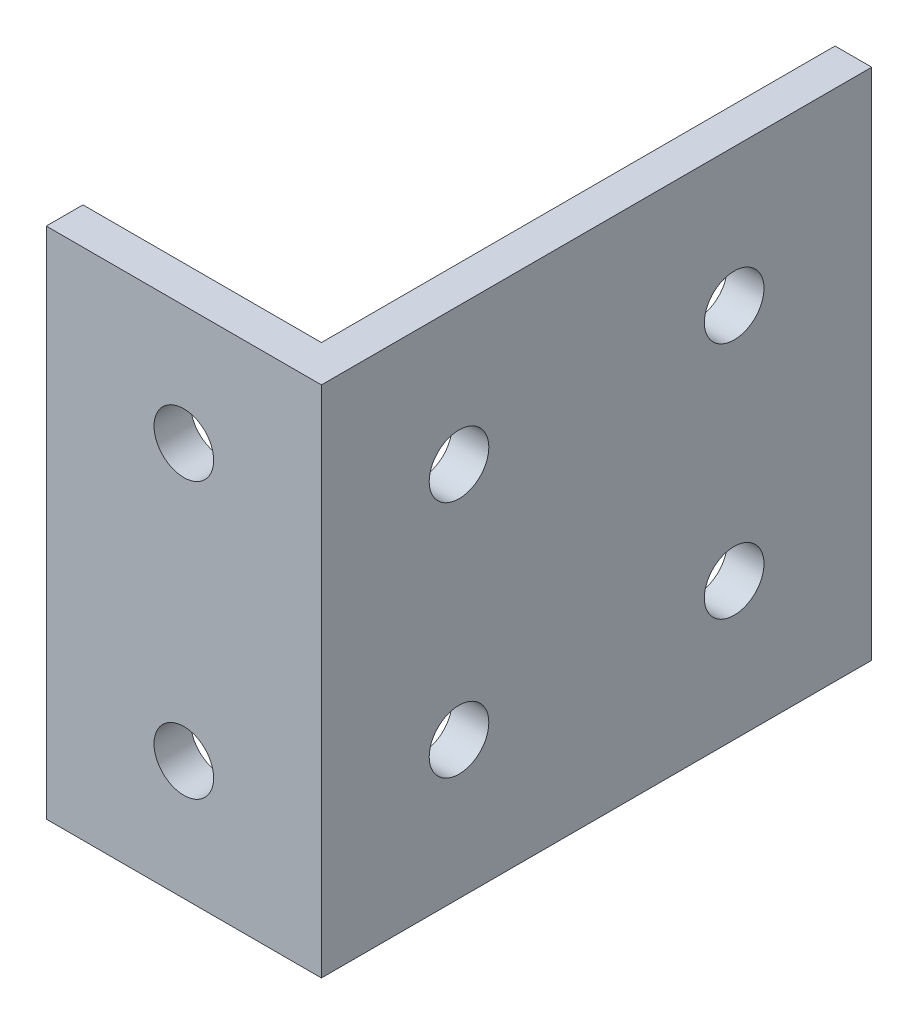
ISO-10303-21;
HEADER;
FILE_DESCRIPTION(('STEP AP214'),'2;1');
FILE_NAME('part.step','',(''),(''),'','','');
FILE_SCHEMA(('AUTOMOTIVE_DESIGN { 1 0 10303 214 1 1 1 1 }'));
ENDSEC;
DATA;
#1=APPLICATION_CONTEXT('core data for automotive mechanical design processes');
#2=APPLICATION_PROTOCOL_DEFINITION('international standard','automotive_design',2000,#1);
#3=PRODUCT_CONTEXT('',#1,'mechanical');
#4=PRODUCT('Part','Part','',(#3));
#5=PRODUCT_RELATED_PRODUCT_CATEGORY('part','',(#4));
#6=PRODUCT_DEFINITION_FORMATION('','',#4);
#7=PRODUCT_DEFINITION_CONTEXT('part definition',#1,'design');
#8=PRODUCT_DEFINITION('design','',#6,#7);
#9=PRODUCT_DEFINITION_SHAPE('','',#8);
#10=(LENGTH_UNIT() NAMED_UNIT(*) SI_UNIT(.MILLI.,.METRE.));
#11=(NAMED_UNIT(*) PLANE_ANGLE_UNIT() SI_UNIT($,.RADIAN.));
#12=(NAMED_UNIT(*) SI_UNIT($,.STERADIAN.) SOLID_ANGLE_UNIT());
#13=UNCERTAINTY_MEASURE_WITH_UNIT(LENGTH_MEASURE(1.E-05),#10,'distance_accuracy_value','');
#14=(GEOMETRIC_REPRESENTATION_CONTEXT(3) GLOBAL_UNCERTAINTY_ASSIGNED_CONTEXT((#13)) GLOBAL_UNIT_ASSIGNED_CONTEXT((#10,
#11,#12)) REPRESENTATION_CONTEXT('',''));
#15=CARTESIAN_POINT('',(0.,0.,0.));
#16=DIRECTION('',(0.,0.,1.));
#17=DIRECTION('',(1.,0.,0.));
#18=AXIS2_PLACEMENT_3D('',#15,#16,#17);
#19=CARTESIAN_POINT('',(0.,56.,-60.));
#20=DIRECTION('',(-1.,0.,0.));
#21=DIRECTION('',(0.,0.,1.));
#22=AXIS2_PLACEMENT_3D('',#19,#20,#21);
#23=PLANE('',#22);
#24=CARTESIAN_POINT('',(0.,41.,-45.));
#25=DIRECTION('',(-1.,0.,0.));
#26=DIRECTION('',(0.,0.,1.));
#27=AXIS2_PLACEMENT_3D('',#24,#25,#26);
#28=CIRCLE('',#27,3.25000000000001);
#29=CARTESIAN_POINT('',(0.,41.,-41.75));
#30=VERTEX_POINT('',#29);
#31=EDGE_CURVE('E164',#30,#30,#28,.T.);
#32=ORIENTED_EDGE('',*,*,#31,.T.);
#33=EDGE_LOOP('',(#32));
#34=FACE_BOUND('',#33,.T.);
#35=CARTESIAN_POINT('',(0.,15.,-45.));
#36=DIRECTION('',(-1.,0.,0.));
#37=DIRECTION('',(0.,0.,1.));
#38=AXIS2_PLACEMENT_3D('',#35,#36,#37);
#39=CIRCLE('',#38,3.25000000000001);
#40=CARTESIAN_POINT('',(0.,15.,-41.75));
#41=VERTEX_POINT('',#40);
#42=EDGE_CURVE('E153',#41,#41,#39,.T.);
#43=ORIENTED_EDGE('',*,*,#42,.T.);
#44=EDGE_LOOP('',(#43));
#45=FACE_BOUND('',#44,.T.);
#46=CARTESIAN_POINT('',(0.,15.,-15.));
#47=DIRECTION('',(-1.,0.,0.));
#48=DIRECTION('',(0.,0.,1.));
#49=AXIS2_PLACEMENT_3D('',#46,#47,#48);
#50=CIRCLE('',#49,3.25000000000001);
#51=CARTESIAN_POINT('',(0.,15.,-11.75));
#52=VERTEX_POINT('',#51);
#53=EDGE_CURVE('E150',#52,#52,#50,.T.);
#54=ORIENTED_EDGE('',*,*,#53,.T.);
#55=EDGE_LOOP('',(#54));
#56=FACE_BOUND('',#55,.T.);
#57=CARTESIAN_POINT('',(0.,41.,-15.));
#58=DIRECTION('',(-1.,0.,0.));
#59=DIRECTION('',(0.,0.,1.));
#60=AXIS2_PLACEMENT_3D('',#57,#58,#59);
#61=CIRCLE('',#60,3.25000000000001);
#62=CARTESIAN_POINT('',(0.,41.,-11.75));
#63=VERTEX_POINT('',#62);
#64=EDGE_CURVE('E147',#63,#63,#61,.T.);
#65=ORIENTED_EDGE('',*,*,#64,.T.);
#66=EDGE_LOOP('',(#65));
#67=FACE_BOUND('',#66,.T.);
#68=DIRECTION('',(0.,0.,-1.));
#69=VECTOR('',#68,1.);
#70=CARTESIAN_POINT('',(0.,0.,-60.));
#71=LINE('',#70,#69);
#72=CARTESIAN_POINT('',(0.,0.,0.));
#73=VERTEX_POINT('',#72);
#74=CARTESIAN_POINT('',(0.,0.,-60.));
#75=VERTEX_POINT('',#74);
#76=EDGE_CURVE('E127',#73,#75,#71,.T.);
#77=ORIENTED_EDGE('',*,*,#76,.T.);
#78=DIRECTION('',(0.,-1.,0.));
#79=VECTOR('',#78,1.);
#80=CARTESIAN_POINT('',(0.,56.,-60.));
#81=LINE('',#80,#79);
#82=CARTESIAN_POINT('',(0.,56.,-60.));
#83=VERTEX_POINT('',#82);
#84=EDGE_CURVE('E11',#83,#75,#81,.T.);
#85=ORIENTED_EDGE('',*,*,#84,.F.);
#86=DIRECTION('',(0.,0.,-1.));
#87=VECTOR('',#86,1.);
#88=CARTESIAN_POINT('',(0.,56.,-60.));
#89=LINE('',#88,#87);
#90=CARTESIAN_POINT('',(0.,56.,0.));
#91=VERTEX_POINT('',#90);
#92=EDGE_CURVE('E138',#91,#83,#89,.T.);
#93=ORIENTED_EDGE('',*,*,#92,.F.);
#94=DIRECTION('',(0.,-1.,0.));
#95=VECTOR('',#94,1.);
#96=CARTESIAN_POINT('',(0.,56.,0.));
#97=LINE('',#96,#95);
#98=EDGE_CURVE('E123',#91,#73,#97,.T.);
#99=ORIENTED_EDGE('',*,*,#98,.T.);
#100=EDGE_LOOP('',(#77,#85,#93,#99));
#101=FACE_BOUND('',#100,.T.);
#102=ADVANCED_FACE('F41',(#34,#45,#56,#67,#101),#23,.F.);
#103=CARTESIAN_POINT('',(-3.99999999999999,56.,-60.));
#104=DIRECTION('',(0.,0.,1.));
#105=DIRECTION('',(1.,0.,0.));
#106=AXIS2_PLACEMENT_3D('',#103,#104,#105);
#107=PLANE('',#106);
#108=DIRECTION('',(-1.,0.,0.));
#109=VECTOR('',#108,1.);
#110=CARTESIAN_POINT('',(-3.99999999999999,0.,-60.));
#111=LINE('',#110,#109);
#112=CARTESIAN_POINT('',(-3.99999999999999,0.,-60.));
#113=VERTEX_POINT('',#112);
#114=EDGE_CURVE('E130',#75,#113,#111,.T.);
#115=ORIENTED_EDGE('',*,*,#114,.T.);
#116=DIRECTION('',(0.,-1.,0.));
#117=VECTOR('',#116,1.);
#118=CARTESIAN_POINT('',(-3.99999999999999,56.,-60.));
#119=LINE('',#118,#117);
#120=CARTESIAN_POINT('',(-3.99999999999999,56.,-60.));
#121=VERTEX_POINT('',#120);
#122=EDGE_CURVE('E50',#121,#113,#119,.T.);
#123=ORIENTED_EDGE('',*,*,#122,.F.);
#124=DIRECTION('',(-1.,0.,0.));
#125=VECTOR('',#124,1.);
#126=CARTESIAN_POINT('',(-3.99999999999999,56.,-60.));
#127=LINE('',#126,#125);
#128=EDGE_CURVE('E96',#83,#121,#127,.T.);
#129=ORIENTED_EDGE('',*,*,#128,.F.);
#130=ORIENTED_EDGE('',*,*,#84,.T.);
#131=EDGE_LOOP('',(#115,#123,#129,#130));
#132=FACE_BOUND('',#131,.T.);
#133=ADVANCED_FACE('F181',(#132),#107,.F.);
#134=CARTESIAN_POINT('',(-3.99999999999999,56.,-4.));
#135=DIRECTION('',(1.,0.,0.));
#136=DIRECTION('',(0.,0.,-1.));
#137=AXIS2_PLACEMENT_3D('',#134,#135,#136);
#138=PLANE('',#137);
#139=CARTESIAN_POINT('',(-3.99999999999999,41.,-45.));
#140=DIRECTION('',(1.,0.,0.));
#141=DIRECTION('',(0.,0.,-1.));
#142=AXIS2_PLACEMENT_3D('',#139,#140,#141);
#143=CIRCLE('',#142,3.25000000000001);
#144=CARTESIAN_POINT('',(-3.99999999999999,41.,-48.25));
#145=VERTEX_POINT('',#144);
#146=EDGE_CURVE('E44',#145,#145,#143,.T.);
#147=ORIENTED_EDGE('',*,*,#146,.T.);
#148=EDGE_LOOP('',(#147));
#149=FACE_BOUND('',#148,.T.);
#150=CARTESIAN_POINT('',(-3.99999999999999,15.,-45.));
#151=DIRECTION('',(1.,0.,0.));
#152=DIRECTION('',(0.,0.,-1.));
#153=AXIS2_PLACEMENT_3D('',#150,#151,#152);
#154=CIRCLE('',#153,3.25000000000001);
#155=CARTESIAN_POINT('',(-3.99999999999999,15.,-48.25));
#156=VERTEX_POINT('',#155);
#157=EDGE_CURVE('E151',#156,#156,#154,.T.);
#158=ORIENTED_EDGE('',*,*,#157,.T.);
#159=EDGE_LOOP('',(#158));
#160=FACE_BOUND('',#159,.T.);
#161=CARTESIAN_POINT('',(-3.99999999999999,15.,-15.));
#162=DIRECTION('',(1.,0.,0.));
#163=DIRECTION('',(0.,0.,-1.));
#164=AXIS2_PLACEMENT_3D('',#161,#162,#163);
#165=CIRCLE('',#164,3.25000000000001);
#166=CARTESIAN_POINT('',(-3.99999999999999,15.,-18.25));
#167=VERTEX_POINT('',#166);
#168=EDGE_CURVE('E148',#167,#167,#165,.T.);
#169=ORIENTED_EDGE('',*,*,#168,.T.);
#170=EDGE_LOOP('',(#169));
#171=FACE_BOUND('',#170,.T.);
#172=CARTESIAN_POINT('',(-3.99999999999999,41.,-15.));
#173=DIRECTION('',(1.,0.,0.));
#174=DIRECTION('',(0.,0.,-1.));
#175=AXIS2_PLACEMENT_3D('',#172,#173,#174);
#176=CIRCLE('',#175,3.25000000000001);
#177=CARTESIAN_POINT('',(-3.99999999999999,41.,-18.25));
#178=VERTEX_POINT('',#177);
#179=EDGE_CURVE('E144',#178,#178,#176,.T.);
#180=ORIENTED_EDGE('',*,*,#179,.T.);
#181=EDGE_LOOP('',(#180));
#182=FACE_BOUND('',#181,.T.);
#183=DIRECTION('',(0.,0.,1.));
#184=VECTOR('',#183,1.);
#185=CARTESIAN_POINT('',(-3.99999999999999,0.,-4.));
#186=LINE('',#185,#184);
#187=CARTESIAN_POINT('',(-3.99999999999999,0.,-4.));
#188=VERTEX_POINT('',#187);
#189=EDGE_CURVE('E133',#113,#188,#186,.T.);
#190=ORIENTED_EDGE('',*,*,#189,.T.);
#191=DIRECTION('',(0.,-1.,0.));
#192=VECTOR('',#191,1.);
#193=CARTESIAN_POINT('',(-3.99999999999999,56.,-4.));
#194=LINE('',#193,#192);
#195=CARTESIAN_POINT('',(-3.99999999999999,56.,-4.));
#196=VERTEX_POINT('',#195);
#197=EDGE_CURVE('E118',#196,#188,#194,.T.);
#198=ORIENTED_EDGE('',*,*,#197,.F.);
#199=DIRECTION('',(0.,0.,1.));
#200=VECTOR('',#199,1.);
#201=CARTESIAN_POINT('',(-3.99999999999999,56.,-4.));
#202=LINE('',#201,#200);
#203=EDGE_CURVE('E109',#121,#196,#202,.T.);
#204=ORIENTED_EDGE('',*,*,#203,.F.);
#205=ORIENTED_EDGE('',*,*,#122,.T.);
#206=EDGE_LOOP('',(#190,#198,#204,#205));
#207=FACE_BOUND('',#206,.T.);
#208=ADVANCED_FACE('F184',(#149,#160,#171,#182,#207),#138,.F.);
#209=CARTESIAN_POINT('',(-30.,56.,-4.));
#210=DIRECTION('',(0.,0.,1.));
#211=DIRECTION('',(1.,0.,0.));
#212=AXIS2_PLACEMENT_3D('',#209,#210,#211);
#213=PLANE('',#212);
#214=CARTESIAN_POINT('',(-15.,43.,-4.));
#215=DIRECTION('',(0.,0.,1.));
#216=DIRECTION('',(1.,0.,0.));
#217=AXIS2_PLACEMENT_3D('',#214,#215,#216);
#218=CIRCLE('',#217,3.25000000000001);
#219=CARTESIAN_POINT('',(-11.75,43.,-4.));
#220=VERTEX_POINT('',#219);
#221=EDGE_CURVE('E131',#220,#220,#218,.T.);
#222=ORIENTED_EDGE('',*,*,#221,.T.);
#223=EDGE_LOOP('',(#222));
#224=FACE_BOUND('',#223,.T.);
#225=CARTESIAN_POINT('',(-15.,13.,-4.));
#226=DIRECTION('',(0.,0.,1.));
#227=DIRECTION('',(1.,0.,0.));
#228=AXIS2_PLACEMENT_3D('',#225,#226,#227);
#229=CIRCLE('',#228,3.25);
#230=CARTESIAN_POINT('',(-11.75,13.,-4.));
#231=VERTEX_POINT('',#230);
#232=EDGE_CURVE('E171',#231,#231,#229,.T.);
#233=ORIENTED_EDGE('',*,*,#232,.T.);
#234=EDGE_LOOP('',(#233));
#235=FACE_BOUND('',#234,.T.);
#236=DIRECTION('',(-1.,0.,0.));
#237=VECTOR('',#236,1.);
#238=CARTESIAN_POINT('',(-30.,0.,-4.));
#239=LINE('',#238,#237);
#240=CARTESIAN_POINT('',(-30.,0.,-4.));
#241=VERTEX_POINT('',#240);
#242=EDGE_CURVE('E117',#188,#241,#239,.T.);
#243=ORIENTED_EDGE('',*,*,#242,.T.);
#244=DIRECTION('',(0.,-1.,0.));
#245=VECTOR('',#244,1.);
#246=CARTESIAN_POINT('',(-30.,56.,-4.));
#247=LINE('',#246,#245);
#248=CARTESIAN_POINT('',(-30.,56.,-4.));
#249=VERTEX_POINT('',#248);
#250=EDGE_CURVE('E114',#249,#241,#247,.T.);
#251=ORIENTED_EDGE('',*,*,#250,.F.);
#252=DIRECTION('',(-1.,0.,0.));
#253=VECTOR('',#252,1.);
#254=CARTESIAN_POINT('',(-30.,56.,-4.));
#255=LINE('',#254,#253);
#256=EDGE_CURVE('E103',#196,#249,#255,.T.);
#257=ORIENTED_EDGE('',*,*,#256,.F.);
#258=ORIENTED_EDGE('',*,*,#197,.T.);
#259=EDGE_LOOP('',(#243,#251,#257,#258));
#260=FACE_BOUND('',#259,.T.);
#261=ADVANCED_FACE('F115',(#224,#235,#260),#213,.F.);
#262=CARTESIAN_POINT('',(-30.,56.,0.));
#263=DIRECTION('',(1.,0.,0.));
#264=DIRECTION('',(0.,0.,-1.));
#265=AXIS2_PLACEMENT_3D('',#262,#263,#264);
#266=PLANE('',#265);
#267=DIRECTION('',(0.,0.,1.));
#268=VECTOR('',#267,1.);
#269=CARTESIAN_POINT('',(-30.,0.,0.));
#270=LINE('',#269,#268);
#271=CARTESIAN_POINT('',(-30.,0.,0.));
#272=VERTEX_POINT('',#271);
#273=EDGE_CURVE('E82',#241,#272,#270,.T.);
#274=ORIENTED_EDGE('',*,*,#273,.T.);
#275=DIRECTION('',(0.,-1.,0.));
#276=VECTOR('',#275,1.);
#277=CARTESIAN_POINT('',(-30.,56.,0.));
#278=LINE('',#277,#276);
#279=CARTESIAN_POINT('',(-30.,56.,0.));
#280=VERTEX_POINT('',#279);
#281=EDGE_CURVE('E119',#280,#272,#278,.T.);
#282=ORIENTED_EDGE('',*,*,#281,.F.);
#283=DIRECTION('',(0.,0.,1.));
#284=VECTOR('',#283,1.);
#285=CARTESIAN_POINT('',(-30.,56.,0.));
#286=LINE('',#285,#284);
#287=EDGE_CURVE('E107',#249,#280,#286,.T.);
#288=ORIENTED_EDGE('',*,*,#287,.F.);
#289=ORIENTED_EDGE('',*,*,#250,.T.);
#290=EDGE_LOOP('',(#274,#282,#288,#289));
#291=FACE_BOUND('',#290,.T.);
#292=ADVANCED_FACE('F121',(#291),#266,.F.);
#293=CARTESIAN_POINT('',(0.,56.,0.));
#294=DIRECTION('',(0.,0.,-1.));
#295=DIRECTION('',(-1.,0.,0.));
#296=AXIS2_PLACEMENT_3D('',#293,#294,#295);
#297=PLANE('',#296);
#298=CARTESIAN_POINT('',(-15.,43.,0.));
#299=DIRECTION('',(0.,0.,-1.));
#300=DIRECTION('',(-1.,0.,0.));
#301=AXIS2_PLACEMENT_3D('',#298,#299,#300);
#302=CIRCLE('',#301,3.25000000000001);
#303=CARTESIAN_POINT('',(-18.25,43.,0.));
#304=VERTEX_POINT('',#303);
#305=EDGE_CURVE('E168',#304,#304,#302,.T.);
#306=ORIENTED_EDGE('',*,*,#305,.T.);
#307=EDGE_LOOP('',(#306));
#308=FACE_BOUND('',#307,.T.);
#309=CARTESIAN_POINT('',(-15.,13.,0.));
#310=DIRECTION('',(0.,0.,-1.));
#311=DIRECTION('',(-1.,0.,0.));
#312=AXIS2_PLACEMENT_3D('',#309,#310,#311);
#313=CIRCLE('',#312,3.25);
#314=CARTESIAN_POINT('',(-18.25,13.,0.));
#315=VERTEX_POINT('',#314);
#316=EDGE_CURVE('E167',#315,#315,#313,.T.);
#317=ORIENTED_EDGE('',*,*,#316,.T.);
#318=EDGE_LOOP('',(#317));
#319=FACE_BOUND('',#318,.T.);
#320=DIRECTION('',(1.,0.,0.));
#321=VECTOR('',#320,1.);
#322=CARTESIAN_POINT('',(0.,0.,0.));
#323=LINE('',#322,#321);
#324=EDGE_CURVE('E88',#272,#73,#323,.T.);
#325=ORIENTED_EDGE('',*,*,#324,.T.);
#326=ORIENTED_EDGE('',*,*,#98,.F.);
#327=DIRECTION('',(1.,0.,0.));
#328=VECTOR('',#327,1.);
#329=CARTESIAN_POINT('',(0.,56.,0.));
#330=LINE('',#329,#328);
#331=EDGE_CURVE('E59',#280,#91,#330,.T.);
#332=ORIENTED_EDGE('',*,*,#331,.F.);
#333=ORIENTED_EDGE('',*,*,#281,.T.);
#334=EDGE_LOOP('',(#325,#326,#332,#333));
#335=FACE_BOUND('',#334,.T.);
#336=ADVANCED_FACE('F189',(#308,#319,#335),#297,.F.);
#337=CARTESIAN_POINT('',(0.,56.,0.));
#338=DIRECTION('',(0.,-1.,0.));
#339=DIRECTION('',(0.,0.,-1.));
#340=AXIS2_PLACEMENT_3D('',#337,#338,#339);
#341=PLANE('',#340);
#342=ORIENTED_EDGE('',*,*,#92,.T.);
#343=ORIENTED_EDGE('',*,*,#128,.T.);
#344=ORIENTED_EDGE('',*,*,#203,.T.);
#345=ORIENTED_EDGE('',*,*,#256,.T.);
#346=ORIENTED_EDGE('',*,*,#287,.T.);
#347=ORIENTED_EDGE('',*,*,#331,.T.);
#348=EDGE_LOOP('',(#342,#343,#344,#345,#346,#347));
#349=FACE_BOUND('',#348,.T.);
#350=ADVANCED_FACE('F105',(#349),#341,.F.);
#351=CARTESIAN_POINT('',(0.,0.,0.));
#352=DIRECTION('',(0.,-1.,0.));
#353=DIRECTION('',(0.,0.,-1.));
#354=AXIS2_PLACEMENT_3D('',#351,#352,#353);
#355=PLANE('',#354);
#356=ORIENTED_EDGE('',*,*,#76,.F.);
#357=ORIENTED_EDGE('',*,*,#324,.F.);
#358=ORIENTED_EDGE('',*,*,#273,.F.);
#359=ORIENTED_EDGE('',*,*,#242,.F.);
#360=ORIENTED_EDGE('',*,*,#189,.F.);
#361=ORIENTED_EDGE('',*,*,#114,.F.);
#362=EDGE_LOOP('',(#356,#357,#358,#359,#360,#361));
#363=FACE_BOUND('',#362,.T.);
#364=ADVANCED_FACE('F187',(#363),#355,.T.);
#365=CARTESIAN_POINT('',(-15.,13.,0.));
#366=DIRECTION('',(0.,0.,-1.));
#367=DIRECTION('',(-1.,0.,0.));
#368=AXIS2_PLACEMENT_3D('',#365,#366,#367);
#369=CYLINDRICAL_SURFACE('',#368,3.25);
#370=ORIENTED_EDGE('',*,*,#316,.F.);
#371=EDGE_LOOP('',(#370));
#372=FACE_BOUND('',#371,.T.);
#373=ORIENTED_EDGE('',*,*,#232,.F.);
#374=EDGE_LOOP('',(#373));
#375=FACE_BOUND('',#374,.T.);
#376=ADVANCED_FACE('F229',(#372,#375),#369,.F.);
#377=CARTESIAN_POINT('',(-15.,43.,0.));
#378=DIRECTION('',(0.,0.,-1.));
#379=DIRECTION('',(-1.,0.,0.));
#380=AXIS2_PLACEMENT_3D('',#377,#378,#379);
#381=CYLINDRICAL_SURFACE('',#380,3.25000000000001);
#382=ORIENTED_EDGE('',*,*,#305,.F.);
#383=EDGE_LOOP('',(#382));
#384=FACE_BOUND('',#383,.T.);
#385=ORIENTED_EDGE('',*,*,#221,.F.);
#386=EDGE_LOOP('',(#385));
#387=FACE_BOUND('',#386,.T.);
#388=ADVANCED_FACE('F220',(#384,#387),#381,.F.);
#389=CARTESIAN_POINT('',(-30.,41.,-15.));
#390=DIRECTION('',(1.,0.,0.));
#391=DIRECTION('',(0.,0.,-1.));
#392=AXIS2_PLACEMENT_3D('',#389,#390,#391);
#393=CYLINDRICAL_SURFACE('',#392,3.25000000000001);
#394=ORIENTED_EDGE('',*,*,#179,.F.);
#395=EDGE_LOOP('',(#394));
#396=FACE_BOUND('',#395,.T.);
#397=ORIENTED_EDGE('',*,*,#64,.F.);
#398=EDGE_LOOP('',(#397));
#399=FACE_BOUND('',#398,.T.);
#400=ADVANCED_FACE('F217',(#396,#399),#393,.F.);
#401=CARTESIAN_POINT('',(-30.,15.,-15.));
#402=DIRECTION('',(1.,0.,0.));
#403=DIRECTION('',(0.,0.,-1.));
#404=AXIS2_PLACEMENT_3D('',#401,#402,#403);
#405=CYLINDRICAL_SURFACE('',#404,3.25000000000001);
#406=ORIENTED_EDGE('',*,*,#168,.F.);
#407=EDGE_LOOP('',(#406));
#408=FACE_BOUND('',#407,.T.);
#409=ORIENTED_EDGE('',*,*,#53,.F.);
#410=EDGE_LOOP('',(#409));
#411=FACE_BOUND('',#410,.T.);
#412=ADVANCED_FACE('F219',(#408,#411),#405,.F.);
#413=CARTESIAN_POINT('',(-30.,15.,-45.));
#414=DIRECTION('',(1.,0.,0.));
#415=DIRECTION('',(0.,0.,-1.));
#416=AXIS2_PLACEMENT_3D('',#413,#414,#415);
#417=CYLINDRICAL_SURFACE('',#416,3.25000000000001);
#418=ORIENTED_EDGE('',*,*,#157,.F.);
#419=EDGE_LOOP('',(#418));
#420=FACE_BOUND('',#419,.T.);
#421=ORIENTED_EDGE('',*,*,#42,.F.);
#422=EDGE_LOOP('',(#421));
#423=FACE_BOUND('',#422,.T.);
#424=ADVANCED_FACE('F226',(#420,#423),#417,.F.);
#425=CARTESIAN_POINT('',(-30.,41.,-45.));
#426=DIRECTION('',(1.,0.,0.));
#427=DIRECTION('',(0.,0.,-1.));
#428=AXIS2_PLACEMENT_3D('',#425,#426,#427);
#429=CYLINDRICAL_SURFACE('',#428,3.25000000000001);
#430=ORIENTED_EDGE('',*,*,#146,.F.);
#431=EDGE_LOOP('',(#430));
#432=FACE_BOUND('',#431,.T.);
#433=ORIENTED_EDGE('',*,*,#31,.F.);
#434=EDGE_LOOP('',(#433));
#435=FACE_BOUND('',#434,.T.);
#436=ADVANCED_FACE('F234',(#432,#435),#429,.F.);
#437=CLOSED_SHELL('',(#102,#133,#208,#261,#292,#336,#350,#364,#376,#388,#400,#412,#424,#436));
#438=MANIFOLD_SOLID_BREP('B2',#437);
#439=ADVANCED_BREP_SHAPE_REPRESENTATION('',(#18,#438),#14);
#440=SHAPE_DEFINITION_REPRESENTATION(#9,#439);
ENDSEC;
END-ISO-10303-21;
